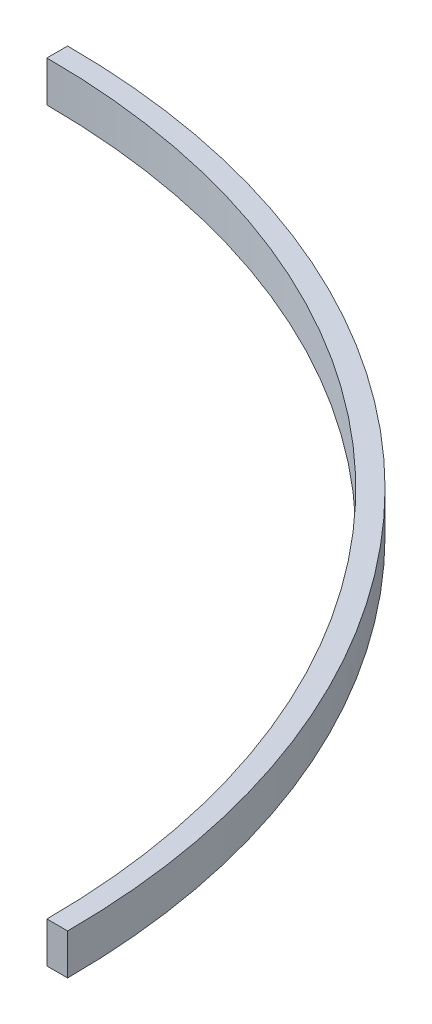
ISO-10303-21;
HEADER;
FILE_DESCRIPTION(('STEP AP214'),'2;1');
FILE_NAME('part.step','',(''),(''),'','','');
FILE_SCHEMA(('AUTOMOTIVE_DESIGN { 1 0 10303 214 1 1 1 1 }'));
ENDSEC;
DATA;
#1=APPLICATION_CONTEXT('core data for automotive mechanical design processes');
#2=APPLICATION_PROTOCOL_DEFINITION('international standard','automotive_design',2000,#1);
#3=PRODUCT_CONTEXT('',#1,'mechanical');
#4=PRODUCT('Part','Part','',(#3));
#5=PRODUCT_RELATED_PRODUCT_CATEGORY('part','',(#4));
#6=PRODUCT_DEFINITION_FORMATION('','',#4);
#7=PRODUCT_DEFINITION_CONTEXT('part definition',#1,'design');
#8=PRODUCT_DEFINITION('design','',#6,#7);
#9=PRODUCT_DEFINITION_SHAPE('','',#8);
#10=(LENGTH_UNIT() NAMED_UNIT(*) SI_UNIT(.MILLI.,.METRE.));
#11=(NAMED_UNIT(*) PLANE_ANGLE_UNIT() SI_UNIT($,.RADIAN.));
#12=(NAMED_UNIT(*) SI_UNIT($,.STERADIAN.) SOLID_ANGLE_UNIT());
#13=UNCERTAINTY_MEASURE_WITH_UNIT(LENGTH_MEASURE(1.E-05),#10,'distance_accuracy_value','');
#14=(GEOMETRIC_REPRESENTATION_CONTEXT(3) GLOBAL_UNCERTAINTY_ASSIGNED_CONTEXT((#13)) GLOBAL_UNIT_ASSIGNED_CONTEXT((#10,
#11,#12)) REPRESENTATION_CONTEXT('',''));
#15=CARTESIAN_POINT('',(0.,0.,0.));
#16=DIRECTION('',(0.,0.,1.));
#17=DIRECTION('',(1.,0.,0.));
#18=AXIS2_PLACEMENT_3D('',#15,#16,#17);
#19=CARTESIAN_POINT('',(0.,25.,0.));
#20=DIRECTION('',(0.,-1.,0.));
#21=DIRECTION('',(0.,0.,-1.));
#22=AXIS2_PLACEMENT_3D('',#19,#20,#21);
#23=CYLINDRICAL_SURFACE('',#22,457.3);
#24=CARTESIAN_POINT('',(0.,0.,0.));
#25=DIRECTION('',(0.,1.,0.));
#26=DIRECTION('',(0.,0.,1.));
#27=AXIS2_PLACEMENT_3D('',#24,#25,#26);
#28=CIRCLE('',#27,457.3);
#29=CARTESIAN_POINT('',(457.3,0.,0.));
#30=VERTEX_POINT('',#29);
#31=CARTESIAN_POINT('',(0.,0.,-457.3));
#32=VERTEX_POINT('',#31);
#33=EDGE_CURVE('E104',#30,#32,#28,.T.);
#34=ORIENTED_EDGE('',*,*,#33,.F.);
#35=DIRECTION('',(0.,-1.,0.));
#36=VECTOR('',#35,1.);
#37=CARTESIAN_POINT('',(457.3,25.,0.));
#38=LINE('',#37,#36);
#39=CARTESIAN_POINT('',(457.3,25.,0.));
#40=VERTEX_POINT('',#39);
#41=EDGE_CURVE('E11',#40,#30,#38,.T.);
#42=ORIENTED_EDGE('',*,*,#41,.F.);
#43=CARTESIAN_POINT('',(0.,25.,0.));
#44=DIRECTION('',(0.,1.,0.));
#45=DIRECTION('',(0.,0.,1.));
#46=AXIS2_PLACEMENT_3D('',#43,#44,#45);
#47=CIRCLE('',#46,457.3);
#48=CARTESIAN_POINT('',(0.,25.,-457.3));
#49=VERTEX_POINT('',#48);
#50=EDGE_CURVE('E89',#40,#49,#47,.T.);
#51=ORIENTED_EDGE('',*,*,#50,.T.);
#52=DIRECTION('',(0.,-1.,0.));
#53=VECTOR('',#52,1.);
#54=CARTESIAN_POINT('',(0.,25.,-457.3));
#55=LINE('',#54,#53);
#56=EDGE_CURVE('E57',#49,#32,#55,.T.);
#57=ORIENTED_EDGE('',*,*,#56,.T.);
#58=EDGE_LOOP('',(#34,#42,#51,#57));
#59=FACE_BOUND('',#58,.T.);
#60=ADVANCED_FACE('F41',(#59),#23,.F.);
#61=CARTESIAN_POINT('',(0.,25.,0.));
#62=DIRECTION('',(0.,0.,-1.));
#63=DIRECTION('',(-1.,0.,0.));
#64=AXIS2_PLACEMENT_3D('',#61,#62,#63);
#65=PLANE('',#64);
#66=DIRECTION('',(1.,0.,0.));
#67=VECTOR('',#66,1.);
#68=CARTESIAN_POINT('',(0.,0.,0.));
#69=LINE('',#68,#67);
#70=CARTESIAN_POINT('',(470.,0.,0.));
#71=VERTEX_POINT('',#70);
#72=EDGE_CURVE('E95',#30,#71,#69,.T.);
#73=ORIENTED_EDGE('',*,*,#72,.T.);
#74=DIRECTION('',(0.,-1.,0.));
#75=VECTOR('',#74,1.);
#76=CARTESIAN_POINT('',(470.,25.,0.));
#77=LINE('',#76,#75);
#78=CARTESIAN_POINT('',(470.,25.,0.));
#79=VERTEX_POINT('',#78);
#80=EDGE_CURVE('E49',#79,#71,#77,.T.);
#81=ORIENTED_EDGE('',*,*,#80,.F.);
#82=DIRECTION('',(1.,0.,0.));
#83=VECTOR('',#82,1.);
#84=CARTESIAN_POINT('',(0.,25.,0.));
#85=LINE('',#84,#83);
#86=EDGE_CURVE('E83',#40,#79,#85,.T.);
#87=ORIENTED_EDGE('',*,*,#86,.F.);
#88=ORIENTED_EDGE('',*,*,#41,.T.);
#89=EDGE_LOOP('',(#73,#81,#87,#88));
#90=FACE_BOUND('',#89,.T.);
#91=ADVANCED_FACE('F93',(#90),#65,.F.);
#92=CARTESIAN_POINT('',(0.,25.,0.));
#93=DIRECTION('',(0.,-1.,0.));
#94=DIRECTION('',(0.,0.,-1.));
#95=AXIS2_PLACEMENT_3D('',#92,#93,#94);
#96=CYLINDRICAL_SURFACE('',#95,470.);
#97=CARTESIAN_POINT('',(0.,0.,0.));
#98=DIRECTION('',(0.,1.,0.));
#99=DIRECTION('',(0.,0.,1.));
#100=AXIS2_PLACEMENT_3D('',#97,#98,#99);
#101=CIRCLE('',#100,470.);
#102=CARTESIAN_POINT('',(0.,0.,-470.));
#103=VERTEX_POINT('',#102);
#104=EDGE_CURVE('E107',#71,#103,#101,.T.);
#105=ORIENTED_EDGE('',*,*,#104,.T.);
#106=DIRECTION('',(0.,-1.,0.));
#107=VECTOR('',#106,1.);
#108=CARTESIAN_POINT('',(0.,25.,-470.));
#109=LINE('',#108,#107);
#110=CARTESIAN_POINT('',(0.,25.,-470.));
#111=VERTEX_POINT('',#110);
#112=EDGE_CURVE('E71',#111,#103,#109,.T.);
#113=ORIENTED_EDGE('',*,*,#112,.F.);
#114=CARTESIAN_POINT('',(0.,25.,0.));
#115=DIRECTION('',(0.,1.,0.));
#116=DIRECTION('',(0.,0.,1.));
#117=AXIS2_PLACEMENT_3D('',#114,#115,#116);
#118=CIRCLE('',#117,470.);
#119=EDGE_CURVE('E88',#79,#111,#118,.T.);
#120=ORIENTED_EDGE('',*,*,#119,.F.);
#121=ORIENTED_EDGE('',*,*,#80,.T.);
#122=EDGE_LOOP('',(#105,#113,#120,#121));
#123=FACE_BOUND('',#122,.T.);
#124=ADVANCED_FACE('F98',(#123),#96,.T.);
#125=CARTESIAN_POINT('',(0.,25.,0.));
#126=DIRECTION('',(-1.,0.,0.));
#127=DIRECTION('',(0.,0.,1.));
#128=AXIS2_PLACEMENT_3D('',#125,#126,#127);
#129=PLANE('',#128);
#130=DIRECTION('',(0.,0.,-1.));
#131=VECTOR('',#130,1.);
#132=CARTESIAN_POINT('',(0.,0.,0.));
#133=LINE('',#132,#131);
#134=EDGE_CURVE('E109',#32,#103,#133,.T.);
#135=ORIENTED_EDGE('',*,*,#134,.F.);
#136=ORIENTED_EDGE('',*,*,#56,.F.);
#137=DIRECTION('',(0.,0.,-1.));
#138=VECTOR('',#137,1.);
#139=CARTESIAN_POINT('',(0.,25.,0.));
#140=LINE('',#139,#138);
#141=EDGE_CURVE('E99',#49,#111,#140,.T.);
#142=ORIENTED_EDGE('',*,*,#141,.T.);
#143=ORIENTED_EDGE('',*,*,#112,.T.);
#144=EDGE_LOOP('',(#135,#136,#142,#143));
#145=FACE_BOUND('',#144,.T.);
#146=ADVANCED_FACE('F114',(#145),#129,.T.);
#147=CARTESIAN_POINT('',(0.,25.,0.));
#148=DIRECTION('',(0.,1.,0.));
#149=DIRECTION('',(0.,0.,1.));
#150=AXIS2_PLACEMENT_3D('',#147,#148,#149);
#151=PLANE('',#150);
#152=ORIENTED_EDGE('',*,*,#50,.F.);
#153=ORIENTED_EDGE('',*,*,#86,.T.);
#154=ORIENTED_EDGE('',*,*,#119,.T.);
#155=ORIENTED_EDGE('',*,*,#141,.F.);
#156=EDGE_LOOP('',(#152,#153,#154,#155));
#157=FACE_BOUND('',#156,.T.);
#158=ADVANCED_FACE('F85',(#157),#151,.T.);
#159=CARTESIAN_POINT('',(0.,0.,0.));
#160=DIRECTION('',(0.,1.,0.));
#161=DIRECTION('',(0.,0.,1.));
#162=AXIS2_PLACEMENT_3D('',#159,#160,#161);
#163=PLANE('',#162);
#164=ORIENTED_EDGE('',*,*,#33,.T.);
#165=ORIENTED_EDGE('',*,*,#134,.T.);
#166=ORIENTED_EDGE('',*,*,#104,.F.);
#167=ORIENTED_EDGE('',*,*,#72,.F.);
#168=EDGE_LOOP('',(#164,#165,#166,#167));
#169=FACE_BOUND('',#168,.T.);
#170=ADVANCED_FACE('F121',(#169),#163,.F.);
#171=CLOSED_SHELL('',(#60,#91,#124,#146,#158,#170));
#172=MANIFOLD_SOLID_BREP('B2',#171);
#173=ADVANCED_BREP_SHAPE_REPRESENTATION('',(#18,#172),#14);
#174=SHAPE_DEFINITION_REPRESENTATION(#9,#173);
ENDSEC;
END-ISO-10303-21;
